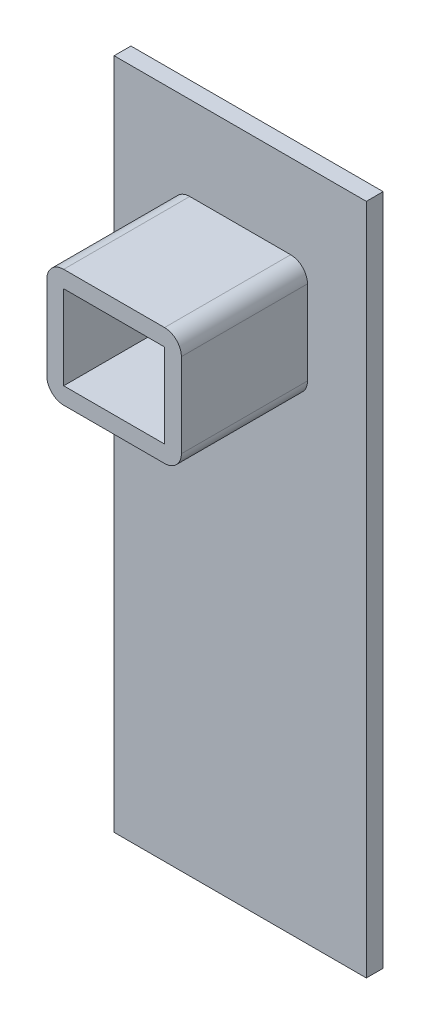
ISO-10303-21;
HEADER;
FILE_DESCRIPTION(('STEP AP214'),'2;1');
FILE_NAME('part.step','',(''),(''),'','','');
FILE_SCHEMA(('AUTOMOTIVE_DESIGN { 1 0 10303 214 1 1 1 1 }'));
ENDSEC;
DATA;
#1=APPLICATION_CONTEXT('core data for automotive mechanical design processes');
#2=APPLICATION_PROTOCOL_DEFINITION('international standard','automotive_design',2000,#1);
#3=PRODUCT_CONTEXT('',#1,'mechanical');
#4=PRODUCT('Part','Part','',(#3));
#5=PRODUCT_RELATED_PRODUCT_CATEGORY('part','',(#4));
#6=PRODUCT_DEFINITION_FORMATION('','',#4);
#7=PRODUCT_DEFINITION_CONTEXT('part definition',#1,'design');
#8=PRODUCT_DEFINITION('design','',#6,#7);
#9=PRODUCT_DEFINITION_SHAPE('','',#8);
#10=(LENGTH_UNIT() NAMED_UNIT(*) SI_UNIT(.MILLI.,.METRE.));
#11=(NAMED_UNIT(*) PLANE_ANGLE_UNIT() SI_UNIT($,.RADIAN.));
#12=(NAMED_UNIT(*) SI_UNIT($,.STERADIAN.) SOLID_ANGLE_UNIT());
#13=UNCERTAINTY_MEASURE_WITH_UNIT(LENGTH_MEASURE(1.E-05),#10,'distance_accuracy_value','');
#14=(GEOMETRIC_REPRESENTATION_CONTEXT(3) GLOBAL_UNCERTAINTY_ASSIGNED_CONTEXT((#13)) GLOBAL_UNIT_ASSIGNED_CONTEXT((#10,
#11,#12)) REPRESENTATION_CONTEXT('',''));
#15=CARTESIAN_POINT('',(0.,0.,0.));
#16=DIRECTION('',(0.,0.,1.));
#17=DIRECTION('',(1.,0.,0.));
#18=AXIS2_PLACEMENT_3D('',#15,#16,#17);
#19=CARTESIAN_POINT('',(0.,0.,2.));
#20=DIRECTION('',(1.,0.,0.));
#21=DIRECTION('',(0.,1.,0.));
#22=AXIS2_PLACEMENT_3D('',#19,#20,#21);
#23=PLANE('',#22);
#24=DIRECTION('',(0.,-1.,0.));
#25=VECTOR('',#24,1.);
#26=CARTESIAN_POINT('',(0.,0.,0.));
#27=LINE('',#26,#25);
#28=CARTESIAN_POINT('',(0.,0.,0.));
#29=VERTEX_POINT('',#28);
#30=CARTESIAN_POINT('',(0.,-80.,0.));
#31=VERTEX_POINT('',#30);
#32=EDGE_CURVE('E178',#29,#31,#27,.T.);
#33=ORIENTED_EDGE('',*,*,#32,.T.);
#34=DIRECTION('',(0.,0.,-1.));
#35=VECTOR('',#34,1.);
#36=CARTESIAN_POINT('',(0.,-80.,2.));
#37=LINE('',#36,#35);
#38=CARTESIAN_POINT('',(0.,-80.,2.));
#39=VERTEX_POINT('',#38);
#40=EDGE_CURVE('E210',#39,#31,#37,.T.);
#41=ORIENTED_EDGE('',*,*,#40,.F.);
#42=DIRECTION('',(0.,-1.,0.));
#43=VECTOR('',#42,1.);
#44=CARTESIAN_POINT('',(0.,0.,2.));
#45=LINE('',#44,#43);
#46=CARTESIAN_POINT('',(0.,0.,2.));
#47=VERTEX_POINT('',#46);
#48=EDGE_CURVE('E187',#47,#39,#45,.T.);
#49=ORIENTED_EDGE('',*,*,#48,.F.);
#50=DIRECTION('',(0.,0.,-1.));
#51=VECTOR('',#50,1.);
#52=CARTESIAN_POINT('',(0.,0.,2.));
#53=LINE('',#52,#51);
#54=EDGE_CURVE('E196',#47,#29,#53,.T.);
#55=ORIENTED_EDGE('',*,*,#54,.T.);
#56=EDGE_LOOP('',(#33,#41,#49,#55));
#57=FACE_BOUND('',#56,.T.);
#58=ADVANCED_FACE('F40',(#57),#23,.F.);
#59=CARTESIAN_POINT('',(0.,-80.,2.));
#60=DIRECTION('',(0.,1.,0.));
#61=DIRECTION('',(0.,0.,1.));
#62=AXIS2_PLACEMENT_3D('',#59,#60,#61);
#63=PLANE('',#62);
#64=DIRECTION('',(1.,0.,0.));
#65=VECTOR('',#64,1.);
#66=CARTESIAN_POINT('',(0.,-80.,0.));
#67=LINE('',#66,#65);
#68=CARTESIAN_POINT('',(30.,-80.,0.));
#69=VERTEX_POINT('',#68);
#70=EDGE_CURVE('E181',#31,#69,#67,.T.);
#71=ORIENTED_EDGE('',*,*,#70,.T.);
#72=DIRECTION('',(0.,0.,-1.));
#73=VECTOR('',#72,1.);
#74=CARTESIAN_POINT('',(30.,-80.,2.));
#75=LINE('',#74,#73);
#76=CARTESIAN_POINT('',(30.,-80.,2.));
#77=VERTEX_POINT('',#76);
#78=EDGE_CURVE('E207',#77,#69,#75,.T.);
#79=ORIENTED_EDGE('',*,*,#78,.F.);
#80=DIRECTION('',(1.,0.,0.));
#81=VECTOR('',#80,1.);
#82=CARTESIAN_POINT('',(0.,-80.,2.));
#83=LINE('',#82,#81);
#84=EDGE_CURVE('E190',#39,#77,#83,.T.);
#85=ORIENTED_EDGE('',*,*,#84,.F.);
#86=ORIENTED_EDGE('',*,*,#40,.T.);
#87=EDGE_LOOP('',(#71,#79,#85,#86));
#88=FACE_BOUND('',#87,.T.);
#89=ADVANCED_FACE('F311',(#88),#63,.F.);
#90=CARTESIAN_POINT('',(30.,0.,2.));
#91=DIRECTION('',(-1.,0.,0.));
#92=DIRECTION('',(0.,-1.,0.));
#93=AXIS2_PLACEMENT_3D('',#90,#91,#92);
#94=PLANE('',#93);
#95=DIRECTION('',(0.,1.,0.));
#96=VECTOR('',#95,1.);
#97=CARTESIAN_POINT('',(30.,0.,0.));
#98=LINE('',#97,#96);
#99=CARTESIAN_POINT('',(30.,0.,0.));
#100=VERTEX_POINT('',#99);
#101=EDGE_CURVE('E199',#69,#100,#98,.T.);
#102=ORIENTED_EDGE('',*,*,#101,.T.);
#103=DIRECTION('',(0.,0.,-1.));
#104=VECTOR('',#103,1.);
#105=CARTESIAN_POINT('',(30.,0.,2.));
#106=LINE('',#105,#104);
#107=CARTESIAN_POINT('',(30.,0.,2.));
#108=VERTEX_POINT('',#107);
#109=EDGE_CURVE('E204',#108,#100,#106,.T.);
#110=ORIENTED_EDGE('',*,*,#109,.F.);
#111=DIRECTION('',(0.,1.,0.));
#112=VECTOR('',#111,1.);
#113=CARTESIAN_POINT('',(30.,0.,2.));
#114=LINE('',#113,#112);
#115=EDGE_CURVE('E193',#77,#108,#114,.T.);
#116=ORIENTED_EDGE('',*,*,#115,.F.);
#117=ORIENTED_EDGE('',*,*,#78,.T.);
#118=EDGE_LOOP('',(#102,#110,#116,#117));
#119=FACE_BOUND('',#118,.T.);
#120=ADVANCED_FACE('F317',(#119),#94,.F.);
#121=CARTESIAN_POINT('',(0.,0.,2.));
#122=DIRECTION('',(0.,-1.,0.));
#123=DIRECTION('',(0.,0.,-1.));
#124=AXIS2_PLACEMENT_3D('',#121,#122,#123);
#125=PLANE('',#124);
#126=DIRECTION('',(-1.,0.,0.));
#127=VECTOR('',#126,1.);
#128=CARTESIAN_POINT('',(0.,0.,0.));
#129=LINE('',#128,#127);
#130=EDGE_CURVE('E191',#100,#29,#129,.T.);
#131=ORIENTED_EDGE('',*,*,#130,.T.);
#132=ORIENTED_EDGE('',*,*,#54,.F.);
#133=DIRECTION('',(-1.,0.,0.));
#134=VECTOR('',#133,1.);
#135=CARTESIAN_POINT('',(0.,0.,2.));
#136=LINE('',#135,#134);
#137=EDGE_CURVE('E195',#108,#47,#136,.T.);
#138=ORIENTED_EDGE('',*,*,#137,.F.);
#139=ORIENTED_EDGE('',*,*,#109,.T.);
#140=EDGE_LOOP('',(#131,#132,#138,#139));
#141=FACE_BOUND('',#140,.T.);
#142=ADVANCED_FACE('F309',(#141),#125,.F.);
#143=CARTESIAN_POINT('',(0.,0.,2.));
#144=DIRECTION('',(0.,0.,1.));
#145=DIRECTION('',(1.,0.,0.));
#146=AXIS2_PLACEMENT_3D('',#143,#144,#145);
#147=PLANE('',#146);
#148=DIRECTION('',(0.,1.,0.));
#149=VECTOR('',#148,1.);
#150=CARTESIAN_POINT('',(7.,0.,2.));
#151=LINE('',#150,#149);
#152=CARTESIAN_POINT('',(7.,-22.,2.));
#153=VERTEX_POINT('',#152);
#154=CARTESIAN_POINT('',(7.,-12.,2.));
#155=VERTEX_POINT('',#154);
#156=EDGE_CURVE('E254',#153,#155,#151,.T.);
#157=ORIENTED_EDGE('',*,*,#156,.T.);
#158=CARTESIAN_POINT('',(9.,-12.,2.));
#159=DIRECTION('',(0.,0.,1.));
#160=DIRECTION('',(1.,0.,0.));
#161=AXIS2_PLACEMENT_3D('',#158,#159,#160);
#162=CIRCLE('',#161,2.);
#163=CARTESIAN_POINT('',(9.,-10.,2.));
#164=VERTEX_POINT('',#163);
#165=EDGE_CURVE('E240',#155,#164,#162,.F.);
#166=ORIENTED_EDGE('',*,*,#165,.T.);
#167=DIRECTION('',(1.,0.,0.));
#168=VECTOR('',#167,1.);
#169=CARTESIAN_POINT('',(0.,-10.,2.));
#170=LINE('',#169,#168);
#171=CARTESIAN_POINT('',(21.,-10.,2.));
#172=VERTEX_POINT('',#171);
#173=EDGE_CURVE('E282',#164,#172,#170,.T.);
#174=ORIENTED_EDGE('',*,*,#173,.T.);
#175=CARTESIAN_POINT('',(21.,-12.,2.));
#176=DIRECTION('',(0.,0.,1.));
#177=DIRECTION('',(1.,0.,0.));
#178=AXIS2_PLACEMENT_3D('',#175,#176,#177);
#179=CIRCLE('',#178,2.);
#180=CARTESIAN_POINT('',(23.,-12.,2.));
#181=VERTEX_POINT('',#180);
#182=EDGE_CURVE('E11',#172,#181,#179,.F.);
#183=ORIENTED_EDGE('',*,*,#182,.T.);
#184=DIRECTION('',(0.,-1.,0.));
#185=VECTOR('',#184,1.);
#186=CARTESIAN_POINT('',(23.,0.,2.));
#187=LINE('',#186,#185);
#188=CARTESIAN_POINT('',(23.,-22.,2.));
#189=VERTEX_POINT('',#188);
#190=EDGE_CURVE('E172',#181,#189,#187,.T.);
#191=ORIENTED_EDGE('',*,*,#190,.T.);
#192=CARTESIAN_POINT('',(21.,-22.,2.));
#193=DIRECTION('',(0.,0.,1.));
#194=DIRECTION('',(1.,0.,0.));
#195=AXIS2_PLACEMENT_3D('',#192,#193,#194);
#196=CIRCLE('',#195,2.);
#197=CARTESIAN_POINT('',(21.,-24.,2.));
#198=VERTEX_POINT('',#197);
#199=EDGE_CURVE('E48',#189,#198,#196,.F.);
#200=ORIENTED_EDGE('',*,*,#199,.T.);
#201=DIRECTION('',(-1.,0.,0.));
#202=VECTOR('',#201,1.);
#203=CARTESIAN_POINT('',(0.,-24.,2.));
#204=LINE('',#203,#202);
#205=CARTESIAN_POINT('',(9.,-24.,2.));
#206=VERTEX_POINT('',#205);
#207=EDGE_CURVE('E248',#198,#206,#204,.T.);
#208=ORIENTED_EDGE('',*,*,#207,.T.);
#209=CARTESIAN_POINT('',(9.,-22.,2.));
#210=DIRECTION('',(0.,0.,1.));
#211=DIRECTION('',(1.,0.,0.));
#212=AXIS2_PLACEMENT_3D('',#209,#210,#211);
#213=CIRCLE('',#212,2.);
#214=EDGE_CURVE('E242',#206,#153,#213,.F.);
#215=ORIENTED_EDGE('',*,*,#214,.T.);
#216=EDGE_LOOP('',(#157,#166,#174,#183,#191,#200,#208,#215));
#217=FACE_BOUND('',#216,.T.);
#218=ORIENTED_EDGE('',*,*,#48,.T.);
#219=ORIENTED_EDGE('',*,*,#84,.T.);
#220=ORIENTED_EDGE('',*,*,#115,.T.);
#221=ORIENTED_EDGE('',*,*,#137,.T.);
#222=EDGE_LOOP('',(#218,#219,#220,#221));
#223=FACE_BOUND('',#222,.T.);
#224=ADVANCED_FACE('F246',(#217,#223),#147,.T.);
#225=CARTESIAN_POINT('',(0.,0.,0.));
#226=DIRECTION('',(0.,0.,1.));
#227=DIRECTION('',(1.,0.,0.));
#228=AXIS2_PLACEMENT_3D('',#225,#226,#227);
#229=PLANE('',#228);
#230=ORIENTED_EDGE('',*,*,#32,.F.);
#231=ORIENTED_EDGE('',*,*,#130,.F.);
#232=ORIENTED_EDGE('',*,*,#101,.F.);
#233=ORIENTED_EDGE('',*,*,#70,.F.);
#234=EDGE_LOOP('',(#230,#231,#232,#233));
#235=FACE_BOUND('',#234,.T.);
#236=ADVANCED_FACE('F308',(#235),#229,.F.);
#237=CARTESIAN_POINT('',(0.,-10.,17.));
#238=DIRECTION('',(0.,1.,0.));
#239=DIRECTION('',(0.,0.,1.));
#240=AXIS2_PLACEMENT_3D('',#237,#238,#239);
#241=PLANE('',#240);
#242=ORIENTED_EDGE('',*,*,#173,.F.);
#243=DIRECTION('',(0.,0.,-1.));
#244=VECTOR('',#243,1.);
#245=CARTESIAN_POINT('',(9.,-10.,17.));
#246=LINE('',#245,#244);
#247=CARTESIAN_POINT('',(9.,-10.,17.));
#248=VERTEX_POINT('',#247);
#249=EDGE_CURVE('E221',#164,#248,#246,.F.);
#250=ORIENTED_EDGE('',*,*,#249,.T.);
#251=DIRECTION('',(1.,0.,0.));
#252=VECTOR('',#251,1.);
#253=CARTESIAN_POINT('',(0.,-10.,17.));
#254=LINE('',#253,#252);
#255=CARTESIAN_POINT('',(21.,-10.,17.));
#256=VERTEX_POINT('',#255);
#257=EDGE_CURVE('E333',#248,#256,#254,.T.);
#258=ORIENTED_EDGE('',*,*,#257,.T.);
#259=DIRECTION('',(0.,0.,-1.));
#260=VECTOR('',#259,1.);
#261=CARTESIAN_POINT('',(21.,-10.,17.));
#262=LINE('',#261,#260);
#263=EDGE_CURVE('E218',#256,#172,#262,.T.);
#264=ORIENTED_EDGE('',*,*,#263,.T.);
#265=EDGE_LOOP('',(#242,#250,#258,#264));
#266=FACE_BOUND('',#265,.T.);
#267=ADVANCED_FACE('F337',(#266),#241,.T.);
#268=CARTESIAN_POINT('',(7.,0.,17.));
#269=DIRECTION('',(-1.,0.,0.));
#270=DIRECTION('',(0.,0.,1.));
#271=AXIS2_PLACEMENT_3D('',#268,#269,#270);
#272=PLANE('',#271);
#273=DIRECTION('',(0.,1.,0.));
#274=VECTOR('',#273,1.);
#275=CARTESIAN_POINT('',(7.,0.,17.));
#276=LINE('',#275,#274);
#277=CARTESIAN_POINT('',(7.,-22.,17.));
#278=VERTEX_POINT('',#277);
#279=CARTESIAN_POINT('',(7.,-12.,17.));
#280=VERTEX_POINT('',#279);
#281=EDGE_CURVE('E270',#278,#280,#276,.T.);
#282=ORIENTED_EDGE('',*,*,#281,.T.);
#283=DIRECTION('',(0.,0.,-1.));
#284=VECTOR('',#283,1.);
#285=CARTESIAN_POINT('',(7.,-12.,17.));
#286=LINE('',#285,#284);
#287=EDGE_CURVE('E215',#280,#155,#286,.T.);
#288=ORIENTED_EDGE('',*,*,#287,.T.);
#289=ORIENTED_EDGE('',*,*,#156,.F.);
#290=DIRECTION('',(0.,0.,-1.));
#291=VECTOR('',#290,1.);
#292=CARTESIAN_POINT('',(7.,-22.,17.));
#293=LINE('',#292,#291);
#294=EDGE_CURVE('E213',#153,#278,#293,.F.);
#295=ORIENTED_EDGE('',*,*,#294,.T.);
#296=EDGE_LOOP('',(#282,#288,#289,#295));
#297=FACE_BOUND('',#296,.T.);
#298=ADVANCED_FACE('F346',(#297),#272,.T.);
#299=CARTESIAN_POINT('',(0.,-24.,17.));
#300=DIRECTION('',(0.,-1.,0.));
#301=DIRECTION('',(1.,0.,0.));
#302=AXIS2_PLACEMENT_3D('',#299,#300,#301);
#303=PLANE('',#302);
#304=DIRECTION('',(-1.,0.,0.));
#305=VECTOR('',#304,1.);
#306=CARTESIAN_POINT('',(0.,-24.,17.));
#307=LINE('',#306,#305);
#308=CARTESIAN_POINT('',(21.,-24.,17.));
#309=VERTEX_POINT('',#308);
#310=CARTESIAN_POINT('',(9.,-24.,17.));
#311=VERTEX_POINT('',#310);
#312=EDGE_CURVE('E263',#309,#311,#307,.T.);
#313=ORIENTED_EDGE('',*,*,#312,.T.);
#314=DIRECTION('',(0.,0.,-1.));
#315=VECTOR('',#314,1.);
#316=CARTESIAN_POINT('',(9.,-24.,17.));
#317=LINE('',#316,#315);
#318=EDGE_CURVE('E233',#311,#206,#317,.T.);
#319=ORIENTED_EDGE('',*,*,#318,.T.);
#320=ORIENTED_EDGE('',*,*,#207,.F.);
#321=DIRECTION('',(0.,0.,-1.));
#322=VECTOR('',#321,1.);
#323=CARTESIAN_POINT('',(21.,-24.,17.));
#324=LINE('',#323,#322);
#325=EDGE_CURVE('E231',#198,#309,#324,.F.);
#326=ORIENTED_EDGE('',*,*,#325,.T.);
#327=EDGE_LOOP('',(#313,#319,#320,#326));
#328=FACE_BOUND('',#327,.T.);
#329=ADVANCED_FACE('F251',(#328),#303,.T.);
#330=CARTESIAN_POINT('',(9.,0.,17.));
#331=DIRECTION('',(-1.,0.,0.));
#332=DIRECTION('',(0.,0.,1.));
#333=AXIS2_PLACEMENT_3D('',#330,#331,#332);
#334=PLANE('',#333);
#335=DIRECTION('',(0.,1.,0.));
#336=VECTOR('',#335,1.);
#337=CARTESIAN_POINT('',(9.,0.,2.));
#338=LINE('',#337,#336);
#339=CARTESIAN_POINT('',(9.,-22.,2.));
#340=VERTEX_POINT('',#339);
#341=CARTESIAN_POINT('',(9.,-12.,2.));
#342=VERTEX_POINT('',#341);
#343=EDGE_CURVE('E176',#340,#342,#338,.T.);
#344=ORIENTED_EDGE('',*,*,#343,.T.);
#345=DIRECTION('',(0.,0.,-1.));
#346=VECTOR('',#345,1.);
#347=CARTESIAN_POINT('',(9.,-12.,17.));
#348=LINE('',#347,#346);
#349=CARTESIAN_POINT('',(9.,-12.,17.));
#350=VERTEX_POINT('',#349);
#351=EDGE_CURVE('E155',#350,#342,#348,.T.);
#352=ORIENTED_EDGE('',*,*,#351,.F.);
#353=DIRECTION('',(0.,1.,0.));
#354=VECTOR('',#353,1.);
#355=CARTESIAN_POINT('',(9.,0.,17.));
#356=LINE('',#355,#354);
#357=CARTESIAN_POINT('',(9.,-22.,17.));
#358=VERTEX_POINT('',#357);
#359=EDGE_CURVE('E162',#358,#350,#356,.T.);
#360=ORIENTED_EDGE('',*,*,#359,.F.);
#361=DIRECTION('',(0.,0.,-1.));
#362=VECTOR('',#361,1.);
#363=CARTESIAN_POINT('',(9.,-22.,17.));
#364=LINE('',#363,#362);
#365=EDGE_CURVE('E267',#358,#340,#364,.T.);
#366=ORIENTED_EDGE('',*,*,#365,.T.);
#367=EDGE_LOOP('',(#344,#352,#360,#366));
#368=FACE_BOUND('',#367,.T.);
#369=ADVANCED_FACE('F174',(#368),#334,.F.);
#370=CARTESIAN_POINT('',(0.,-12.,17.));
#371=DIRECTION('',(0.,1.,0.));
#372=DIRECTION('',(0.,0.,1.));
#373=AXIS2_PLACEMENT_3D('',#370,#371,#372);
#374=PLANE('',#373);
#375=DIRECTION('',(1.,0.,0.));
#376=VECTOR('',#375,1.);
#377=CARTESIAN_POINT('',(0.,-12.,2.));
#378=LINE('',#377,#376);
#379=CARTESIAN_POINT('',(21.,-12.,2.));
#380=VERTEX_POINT('',#379);
#381=EDGE_CURVE('E275',#342,#380,#378,.T.);
#382=ORIENTED_EDGE('',*,*,#381,.T.);
#383=DIRECTION('',(0.,0.,-1.));
#384=VECTOR('',#383,1.);
#385=CARTESIAN_POINT('',(21.,-12.,17.));
#386=LINE('',#385,#384);
#387=CARTESIAN_POINT('',(21.,-12.,17.));
#388=VERTEX_POINT('',#387);
#389=EDGE_CURVE('E158',#388,#380,#386,.T.);
#390=ORIENTED_EDGE('',*,*,#389,.F.);
#391=DIRECTION('',(1.,0.,0.));
#392=VECTOR('',#391,1.);
#393=CARTESIAN_POINT('',(0.,-12.,17.));
#394=LINE('',#393,#392);
#395=EDGE_CURVE('E151',#350,#388,#394,.T.);
#396=ORIENTED_EDGE('',*,*,#395,.F.);
#397=ORIENTED_EDGE('',*,*,#351,.T.);
#398=EDGE_LOOP('',(#382,#390,#396,#397));
#399=FACE_BOUND('',#398,.T.);
#400=ADVANCED_FACE('F153',(#399),#374,.F.);
#401=CARTESIAN_POINT('',(21.,0.,17.));
#402=DIRECTION('',(1.,0.,0.));
#403=DIRECTION('',(0.,0.,-1.));
#404=AXIS2_PLACEMENT_3D('',#401,#402,#403);
#405=PLANE('',#404);
#406=DIRECTION('',(0.,-1.,0.));
#407=VECTOR('',#406,1.);
#408=CARTESIAN_POINT('',(21.,0.,2.));
#409=LINE('',#408,#407);
#410=CARTESIAN_POINT('',(21.,-22.,2.));
#411=VERTEX_POINT('',#410);
#412=EDGE_CURVE('E277',#380,#411,#409,.T.);
#413=ORIENTED_EDGE('',*,*,#412,.T.);
#414=DIRECTION('',(0.,0.,-1.));
#415=VECTOR('',#414,1.);
#416=CARTESIAN_POINT('',(21.,-22.,17.));
#417=LINE('',#416,#415);
#418=CARTESIAN_POINT('',(21.,-22.,17.));
#419=VERTEX_POINT('',#418);
#420=EDGE_CURVE('E183',#419,#411,#417,.T.);
#421=ORIENTED_EDGE('',*,*,#420,.F.);
#422=DIRECTION('',(0.,-1.,0.));
#423=VECTOR('',#422,1.);
#424=CARTESIAN_POINT('',(21.,0.,17.));
#425=LINE('',#424,#423);
#426=EDGE_CURVE('E161',#388,#419,#425,.T.);
#427=ORIENTED_EDGE('',*,*,#426,.F.);
#428=ORIENTED_EDGE('',*,*,#389,.T.);
#429=EDGE_LOOP('',(#413,#421,#427,#428));
#430=FACE_BOUND('',#429,.T.);
#431=ADVANCED_FACE('F291',(#430),#405,.F.);
#432=CARTESIAN_POINT('',(0.,-22.,17.));
#433=DIRECTION('',(0.,-1.,0.));
#434=DIRECTION('',(0.,0.,-1.));
#435=AXIS2_PLACEMENT_3D('',#432,#433,#434);
#436=PLANE('',#435);
#437=DIRECTION('',(-1.,0.,0.));
#438=VECTOR('',#437,1.);
#439=CARTESIAN_POINT('',(0.,-22.,2.));
#440=LINE('',#439,#438);
#441=EDGE_CURVE('E280',#411,#340,#440,.T.);
#442=ORIENTED_EDGE('',*,*,#441,.T.);
#443=ORIENTED_EDGE('',*,*,#365,.F.);
#444=DIRECTION('',(-1.,0.,0.));
#445=VECTOR('',#444,1.);
#446=CARTESIAN_POINT('',(0.,-22.,17.));
#447=LINE('',#446,#445);
#448=EDGE_CURVE('E168',#419,#358,#447,.T.);
#449=ORIENTED_EDGE('',*,*,#448,.F.);
#450=ORIENTED_EDGE('',*,*,#420,.T.);
#451=EDGE_LOOP('',(#442,#443,#449,#450));
#452=FACE_BOUND('',#451,.T.);
#453=ADVANCED_FACE('F287',(#452),#436,.F.);
#454=CARTESIAN_POINT('',(23.,0.,17.));
#455=DIRECTION('',(1.,0.,0.));
#456=DIRECTION('',(0.,0.,-1.));
#457=AXIS2_PLACEMENT_3D('',#454,#455,#456);
#458=PLANE('',#457);
#459=DIRECTION('',(0.,-1.,0.));
#460=VECTOR('',#459,1.);
#461=CARTESIAN_POINT('',(23.,0.,17.));
#462=LINE('',#461,#460);
#463=CARTESIAN_POINT('',(23.,-12.,17.));
#464=VERTEX_POINT('',#463);
#465=CARTESIAN_POINT('',(23.,-22.,17.));
#466=VERTEX_POINT('',#465);
#467=EDGE_CURVE('E261',#464,#466,#462,.T.);
#468=ORIENTED_EDGE('',*,*,#467,.T.);
#469=DIRECTION('',(0.,0.,-1.));
#470=VECTOR('',#469,1.);
#471=CARTESIAN_POINT('',(23.,-22.,17.));
#472=LINE('',#471,#470);
#473=EDGE_CURVE('E238',#466,#189,#472,.T.);
#474=ORIENTED_EDGE('',*,*,#473,.T.);
#475=ORIENTED_EDGE('',*,*,#190,.F.);
#476=DIRECTION('',(0.,0.,-1.));
#477=VECTOR('',#476,1.);
#478=CARTESIAN_POINT('',(23.,-12.,17.));
#479=LINE('',#478,#477);
#480=EDGE_CURVE('E236',#181,#464,#479,.F.);
#481=ORIENTED_EDGE('',*,*,#480,.T.);
#482=EDGE_LOOP('',(#468,#474,#475,#481));
#483=FACE_BOUND('',#482,.T.);
#484=ADVANCED_FACE('F265',(#483),#458,.T.);
#485=CARTESIAN_POINT('',(0.,0.,17.));
#486=DIRECTION('',(0.,0.,1.));
#487=DIRECTION('',(1.,0.,0.));
#488=AXIS2_PLACEMENT_3D('',#485,#486,#487);
#489=PLANE('',#488);
#490=ORIENTED_EDGE('',*,*,#359,.T.);
#491=ORIENTED_EDGE('',*,*,#395,.T.);
#492=ORIENTED_EDGE('',*,*,#426,.T.);
#493=ORIENTED_EDGE('',*,*,#448,.T.);
#494=EDGE_LOOP('',(#490,#491,#492,#493));
#495=FACE_BOUND('',#494,.T.);
#496=ORIENTED_EDGE('',*,*,#257,.F.);
#497=CARTESIAN_POINT('',(9.,-12.,17.));
#498=DIRECTION('',(0.,0.,1.));
#499=DIRECTION('',(1.,0.,0.));
#500=AXIS2_PLACEMENT_3D('',#497,#498,#499);
#501=CIRCLE('',#500,2.);
#502=EDGE_CURVE('E229',#248,#280,#501,.T.);
#503=ORIENTED_EDGE('',*,*,#502,.T.);
#504=ORIENTED_EDGE('',*,*,#281,.F.);
#505=CARTESIAN_POINT('',(9.,-22.,17.));
#506=DIRECTION('',(0.,0.,1.));
#507=DIRECTION('',(1.,0.,0.));
#508=AXIS2_PLACEMENT_3D('',#505,#506,#507);
#509=CIRCLE('',#508,2.);
#510=EDGE_CURVE('E227',#278,#311,#509,.T.);
#511=ORIENTED_EDGE('',*,*,#510,.T.);
#512=ORIENTED_EDGE('',*,*,#312,.F.);
#513=CARTESIAN_POINT('',(21.,-22.,17.));
#514=DIRECTION('',(0.,0.,1.));
#515=DIRECTION('',(1.,0.,0.));
#516=AXIS2_PLACEMENT_3D('',#513,#514,#515);
#517=CIRCLE('',#516,2.);
#518=EDGE_CURVE('E225',#309,#466,#517,.T.);
#519=ORIENTED_EDGE('',*,*,#518,.T.);
#520=ORIENTED_EDGE('',*,*,#467,.F.);
#521=CARTESIAN_POINT('',(21.,-12.,17.));
#522=DIRECTION('',(0.,0.,1.));
#523=DIRECTION('',(1.,0.,0.));
#524=AXIS2_PLACEMENT_3D('',#521,#522,#523);
#525=CIRCLE('',#524,2.);
#526=EDGE_CURVE('E223',#464,#256,#525,.T.);
#527=ORIENTED_EDGE('',*,*,#526,.T.);
#528=EDGE_LOOP('',(#496,#503,#504,#511,#512,#519,#520,#527));
#529=FACE_BOUND('',#528,.T.);
#530=ADVANCED_FACE('F165',(#495,#529),#489,.T.);
#531=ORIENTED_EDGE('',*,*,#381,.F.);
#532=ORIENTED_EDGE('',*,*,#343,.F.);
#533=ORIENTED_EDGE('',*,*,#441,.F.);
#534=ORIENTED_EDGE('',*,*,#412,.F.);
#535=EDGE_LOOP('',(#531,#532,#533,#534));
#536=FACE_BOUND('',#535,.T.);
#537=ADVANCED_FACE('F293',(#536),#147,.T.);
#538=CARTESIAN_POINT('',(9.,-12.,17.));
#539=DIRECTION('',(0.,0.,-1.));
#540=DIRECTION('',(-1.,0.,0.));
#541=AXIS2_PLACEMENT_3D('',#538,#539,#540);
#542=CYLINDRICAL_SURFACE('',#541,2.);
#543=ORIENTED_EDGE('',*,*,#502,.F.);
#544=ORIENTED_EDGE('',*,*,#249,.F.);
#545=ORIENTED_EDGE('',*,*,#165,.F.);
#546=ORIENTED_EDGE('',*,*,#287,.F.);
#547=EDGE_LOOP('',(#543,#544,#545,#546));
#548=FACE_BOUND('',#547,.T.);
#549=ADVANCED_FACE('F295',(#548),#542,.T.);
#550=CARTESIAN_POINT('',(9.,-22.,17.));
#551=DIRECTION('',(0.,0.,-1.));
#552=DIRECTION('',(-1.,0.,0.));
#553=AXIS2_PLACEMENT_3D('',#550,#551,#552);
#554=CYLINDRICAL_SURFACE('',#553,2.);
#555=ORIENTED_EDGE('',*,*,#510,.F.);
#556=ORIENTED_EDGE('',*,*,#294,.F.);
#557=ORIENTED_EDGE('',*,*,#214,.F.);
#558=ORIENTED_EDGE('',*,*,#318,.F.);
#559=EDGE_LOOP('',(#555,#556,#557,#558));
#560=FACE_BOUND('',#559,.T.);
#561=ADVANCED_FACE('F301',(#560),#554,.T.);
#562=CARTESIAN_POINT('',(21.,-22.,17.));
#563=DIRECTION('',(0.,0.,-1.));
#564=DIRECTION('',(-1.,0.,0.));
#565=AXIS2_PLACEMENT_3D('',#562,#563,#564);
#566=CYLINDRICAL_SURFACE('',#565,2.);
#567=ORIENTED_EDGE('',*,*,#518,.F.);
#568=ORIENTED_EDGE('',*,*,#325,.F.);
#569=ORIENTED_EDGE('',*,*,#199,.F.);
#570=ORIENTED_EDGE('',*,*,#473,.F.);
#571=EDGE_LOOP('',(#567,#568,#569,#570));
#572=FACE_BOUND('',#571,.T.);
#573=ADVANCED_FACE('F257',(#572),#566,.T.);
#574=CARTESIAN_POINT('',(21.,-12.,17.));
#575=DIRECTION('',(0.,0.,-1.));
#576=DIRECTION('',(-1.,0.,0.));
#577=AXIS2_PLACEMENT_3D('',#574,#575,#576);
#578=CYLINDRICAL_SURFACE('',#577,2.);
#579=ORIENTED_EDGE('',*,*,#526,.F.);
#580=ORIENTED_EDGE('',*,*,#480,.F.);
#581=ORIENTED_EDGE('',*,*,#182,.F.);
#582=ORIENTED_EDGE('',*,*,#263,.F.);
#583=EDGE_LOOP('',(#579,#580,#581,#582));
#584=FACE_BOUND('',#583,.T.);
#585=ADVANCED_FACE('F42',(#584),#578,.T.);
#586=CLOSED_SHELL('',(#58,#89,#120,#142,#224,#236,#267,#298,#329,#369,#400,#431,#453,#484,#530,
#537,#549,#561,#573,#585));
#587=MANIFOLD_SOLID_BREP('B2',#586);
#588=ADVANCED_BREP_SHAPE_REPRESENTATION('',(#18,#587),#14);
#589=SHAPE_DEFINITION_REPRESENTATION(#9,#588);
ENDSEC;
END-ISO-10303-21;
